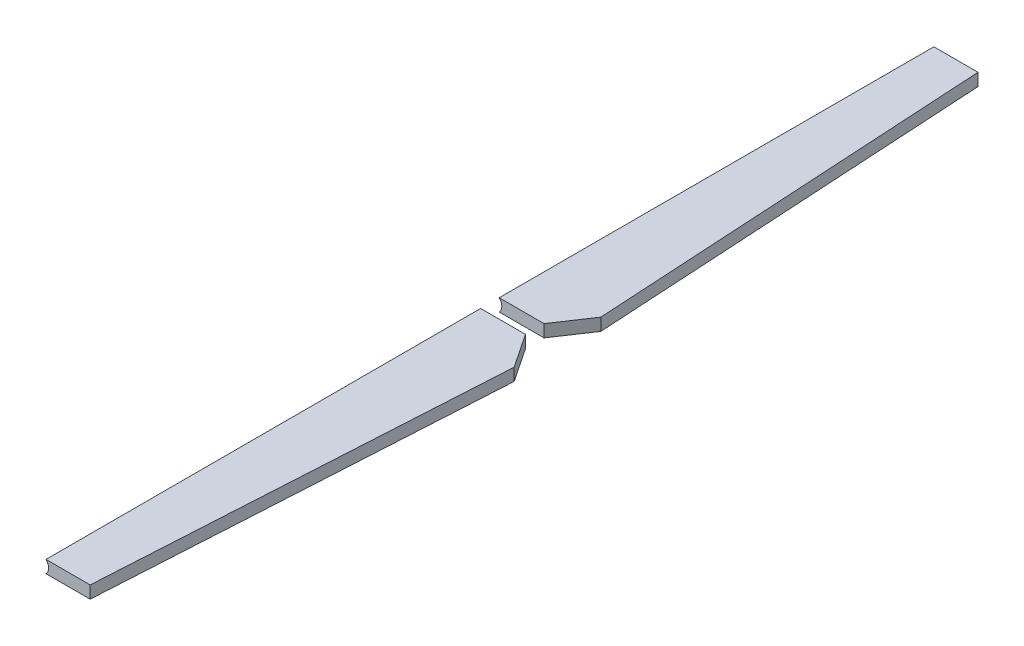
ISO-10303-21;
HEADER;
FILE_DESCRIPTION(('STEP AP214'),'2;1');
FILE_NAME('part.step','',(''),(''),'','','');
FILE_SCHEMA(('AUTOMOTIVE_DESIGN { 1 0 10303 214 1 1 1 1 }'));
ENDSEC;
DATA;
#1=APPLICATION_CONTEXT('core data for automotive mechanical design processes');
#2=APPLICATION_PROTOCOL_DEFINITION('international standard','automotive_design',2000,#1);
#3=PRODUCT_CONTEXT('',#1,'mechanical');
#4=PRODUCT('Part','Part','',(#3));
#5=PRODUCT_RELATED_PRODUCT_CATEGORY('part','',(#4));
#6=PRODUCT_DEFINITION_FORMATION('','',#4);
#7=PRODUCT_DEFINITION_CONTEXT('part definition',#1,'design');
#8=PRODUCT_DEFINITION('design','',#6,#7);
#9=PRODUCT_DEFINITION_SHAPE('','',#8);
#10=(LENGTH_UNIT() NAMED_UNIT(*) SI_UNIT(.MILLI.,.METRE.));
#11=(NAMED_UNIT(*) PLANE_ANGLE_UNIT() SI_UNIT($,.RADIAN.));
#12=(NAMED_UNIT(*) SI_UNIT($,.STERADIAN.) SOLID_ANGLE_UNIT());
#13=UNCERTAINTY_MEASURE_WITH_UNIT(LENGTH_MEASURE(1.E-05),#10,'distance_accuracy_value','');
#14=(GEOMETRIC_REPRESENTATION_CONTEXT(3) GLOBAL_UNCERTAINTY_ASSIGNED_CONTEXT((#13)) GLOBAL_UNIT_ASSIGNED_CONTEXT((#10,
#11,#12)) REPRESENTATION_CONTEXT('',''));
#15=CARTESIAN_POINT('',(0.,0.,0.));
#16=DIRECTION('',(0.,0.,1.));
#17=DIRECTION('',(1.,0.,0.));
#18=AXIS2_PLACEMENT_3D('',#15,#16,#17);
#19=CARTESIAN_POINT('',(30.8367101860676,8.,-146.142614676289));
#20=DIRECTION('',(0.,0.,1.));
#21=DIRECTION('',(-1.,0.,0.));
#22=AXIS2_PLACEMENT_3D('',#19,#20,#21);
#23=PLANE('',#22);
#24=DIRECTION('',(1.,0.,0.));
#25=VECTOR('',#24,1.);
#26=CARTESIAN_POINT('',(30.8367101860676,8.,-146.142614676289));
#27=LINE('',#26,#25);
#28=CARTESIAN_POINT('',(9.44634998023571,8.,-146.142614676289));
#29=VERTEX_POINT('',#28);
#30=CARTESIAN_POINT('',(30.8367101860676,8.,-146.142614676289));
#31=VERTEX_POINT('',#30);
#32=EDGE_CURVE('E104',#29,#31,#27,.T.);
#33=ORIENTED_EDGE('',*,*,#32,.T.);
#34=DIRECTION('',(0.,-1.,0.));
#35=VECTOR('',#34,1.);
#36=CARTESIAN_POINT('',(30.8367101860676,8.,-146.142614676289));
#37=LINE('',#36,#35);
#38=CARTESIAN_POINT('',(30.8367101860676,2.,-146.142614676289));
#39=VERTEX_POINT('',#38);
#40=EDGE_CURVE('E12',#31,#39,#37,.T.);
#41=ORIENTED_EDGE('',*,*,#40,.T.);
#42=DIRECTION('',(1.,0.,0.));
#43=VECTOR('',#42,1.);
#44=CARTESIAN_POINT('',(30.8367101860676,2.,-146.142614676289));
#45=LINE('',#44,#43);
#46=CARTESIAN_POINT('',(9.44634998023571,2.,-146.142614676289));
#47=VERTEX_POINT('',#46);
#48=EDGE_CURVE('E121',#47,#39,#45,.T.);
#49=ORIENTED_EDGE('',*,*,#48,.F.);
#50=CARTESIAN_POINT('',(6.4463499802357,5.,-146.142614676289));
#51=DIRECTION('',(0.,0.,1.));
#52=DIRECTION('',(-1.,0.,0.));
#53=AXIS2_PLACEMENT_3D('',#50,#51,#52);
#54=CIRCLE('',#53,4.24264068711929);
#55=EDGE_CURVE('E109',#47,#29,#54,.T.);
#56=ORIENTED_EDGE('',*,*,#55,.T.);
#57=EDGE_LOOP('',(#33,#41,#49,#56));
#58=FACE_BOUND('',#57,.T.);
#59=ADVANCED_FACE('F49',(#58),#23,.F.);
#60=CARTESIAN_POINT('',(42.1898500211649,8.,47.8686247876649));
#61=DIRECTION('',(-0.998292209621749,0.,0.0584180127060611));
#62=DIRECTION('',(-0.0584180127060611,0.,-0.998292209621749));
#63=AXIS2_PLACEMENT_3D('',#60,#61,#62);
#64=PLANE('',#63);
#65=DIRECTION('',(0.0584180127060611,0.,0.998292209621749));
#66=VECTOR('',#65,1.);
#67=CARTESIAN_POINT('',(42.1898500211649,2.,47.8686247876649));
#68=LINE('',#67,#66);
#69=CARTESIAN_POINT('',(42.1898500211649,2.,47.8686247876649));
#70=VERTEX_POINT('',#69);
#71=EDGE_CURVE('E124',#39,#70,#68,.T.);
#72=ORIENTED_EDGE('',*,*,#71,.F.);
#73=ORIENTED_EDGE('',*,*,#40,.F.);
#74=DIRECTION('',(0.0584180127060611,0.,0.998292209621749));
#75=VECTOR('',#74,1.);
#76=CARTESIAN_POINT('',(42.1898500211649,8.,47.8686247876649));
#77=LINE('',#76,#75);
#78=CARTESIAN_POINT('',(42.1898500211649,8.,47.8686247876649));
#79=VERTEX_POINT('',#78);
#80=EDGE_CURVE('E93',#31,#79,#77,.T.);
#81=ORIENTED_EDGE('',*,*,#80,.T.);
#82=DIRECTION('',(0.,-1.,0.));
#83=VECTOR('',#82,1.);
#84=CARTESIAN_POINT('',(42.1898500211649,8.,47.8686247876649));
#85=LINE('',#84,#83);
#86=EDGE_CURVE('E57',#79,#70,#85,.T.);
#87=ORIENTED_EDGE('',*,*,#86,.T.);
#88=EDGE_LOOP('',(#72,#73,#81,#87));
#89=FACE_BOUND('',#88,.T.);
#90=ADVANCED_FACE('F133',(#89),#64,.F.);
#91=CARTESIAN_POINT('',(42.1898500211649,8.,47.8686247876649));
#92=DIRECTION('',(-0.83156761778236,0.,-0.555423529440167));
#93=DIRECTION('',(0.555423529440167,0.,-0.83156761778236));
#94=AXIS2_PLACEMENT_3D('',#91,#92,#93);
#95=PLANE('',#94);
#96=DIRECTION('',(-0.555423529440167,0.,0.83156761778236));
#97=VECTOR('',#96,1.);
#98=CARTESIAN_POINT('',(42.1898500211649,2.,47.8686247876649));
#99=LINE('',#98,#97);
#100=CARTESIAN_POINT('',(31.1699406207034,2.,64.3673853237115));
#101=VERTEX_POINT('',#100);
#102=EDGE_CURVE('E127',#70,#101,#99,.T.);
#103=ORIENTED_EDGE('',*,*,#102,.F.);
#104=ORIENTED_EDGE('',*,*,#86,.F.);
#105=DIRECTION('',(-0.555423529440167,0.,0.83156761778236));
#106=VECTOR('',#105,1.);
#107=CARTESIAN_POINT('',(42.1898500211649,8.,47.8686247876649));
#108=LINE('',#107,#106);
#109=CARTESIAN_POINT('',(31.1699406207034,8.,64.3673853237115));
#110=VERTEX_POINT('',#109);
#111=EDGE_CURVE('E114',#79,#110,#108,.T.);
#112=ORIENTED_EDGE('',*,*,#111,.T.);
#113=DIRECTION('',(0.,-1.,0.));
#114=VECTOR('',#113,1.);
#115=CARTESIAN_POINT('',(31.1699406207034,8.,64.3673853237115));
#116=LINE('',#115,#114);
#117=EDGE_CURVE('E112',#110,#101,#116,.T.);
#118=ORIENTED_EDGE('',*,*,#117,.T.);
#119=EDGE_LOOP('',(#103,#104,#112,#118));
#120=FACE_BOUND('',#119,.T.);
#121=ADVANCED_FACE('F145',(#120),#95,.F.);
#122=CARTESIAN_POINT('',(9.44634998023578,8.,64.3673853237115));
#123=DIRECTION('',(0.,0.,-1.));
#124=DIRECTION('',(1.,0.,0.));
#125=AXIS2_PLACEMENT_3D('',#122,#123,#124);
#126=PLANE('',#125);
#127=DIRECTION('',(-1.,0.,0.));
#128=VECTOR('',#127,1.);
#129=CARTESIAN_POINT('',(9.44634998023578,2.,64.3673853237115));
#130=LINE('',#129,#128);
#131=CARTESIAN_POINT('',(9.44634998023578,2.,64.3673853237115));
#132=VERTEX_POINT('',#131);
#133=EDGE_CURVE('E82',#101,#132,#130,.T.);
#134=ORIENTED_EDGE('',*,*,#133,.F.);
#135=ORIENTED_EDGE('',*,*,#117,.F.);
#136=DIRECTION('',(-1.,0.,0.));
#137=VECTOR('',#136,1.);
#138=CARTESIAN_POINT('',(21.5545927166665,8.,64.3673853237115));
#139=LINE('',#138,#137);
#140=CARTESIAN_POINT('',(9.44634998023571,8.,64.3673853237115));
#141=VERTEX_POINT('',#140);
#142=EDGE_CURVE('E65',#110,#141,#139,.T.);
#143=ORIENTED_EDGE('',*,*,#142,.T.);
#144=CARTESIAN_POINT('',(6.4463499802357,5.,64.3673853237115));
#145=DIRECTION('',(0.,0.,1.));
#146=DIRECTION('',(-1.,0.,0.));
#147=AXIS2_PLACEMENT_3D('',#144,#145,#146);
#148=CIRCLE('',#147,4.24264068711929);
#149=EDGE_CURVE('E107',#132,#141,#148,.T.);
#150=ORIENTED_EDGE('',*,*,#149,.F.);
#151=EDGE_LOOP('',(#134,#135,#143,#150));
#152=FACE_BOUND('',#151,.T.);
#153=ADVANCED_FACE('F111',(#152),#126,.F.);
#154=CARTESIAN_POINT('',(9.44634998023571,8.,68.8673853237115));
#155=DIRECTION('',(0.,-1.,0.));
#156=DIRECTION('',(0.,0.,1.));
#157=AXIS2_PLACEMENT_3D('',#154,#155,#156);
#158=PLANE('',#157);
#159=DIRECTION('',(0.,0.,-1.));
#160=VECTOR('',#159,1.);
#161=CARTESIAN_POINT('',(9.44634998023571,8.,-146.142614676289));
#162=LINE('',#161,#160);
#163=EDGE_CURVE('E101',#141,#29,#162,.T.);
#164=ORIENTED_EDGE('',*,*,#163,.F.);
#165=ORIENTED_EDGE('',*,*,#142,.F.);
#166=ORIENTED_EDGE('',*,*,#111,.F.);
#167=ORIENTED_EDGE('',*,*,#80,.F.);
#168=ORIENTED_EDGE('',*,*,#32,.F.);
#169=EDGE_LOOP('',(#164,#165,#166,#167,#168));
#170=FACE_BOUND('',#169,.T.);
#171=ADVANCED_FACE('F102',(#170),#158,.F.);
#172=CARTESIAN_POINT('',(9.44634998023571,2.,68.8673853237115));
#173=DIRECTION('',(0.,-1.,0.));
#174=DIRECTION('',(0.,0.,1.));
#175=AXIS2_PLACEMENT_3D('',#172,#173,#174);
#176=PLANE('',#175);
#177=DIRECTION('',(0.,0.,-1.));
#178=VECTOR('',#177,1.);
#179=CARTESIAN_POINT('',(9.44634998023571,2.,-146.142614676289));
#180=LINE('',#179,#178);
#181=EDGE_CURVE('E89',#132,#47,#180,.T.);
#182=ORIENTED_EDGE('',*,*,#181,.T.);
#183=ORIENTED_EDGE('',*,*,#48,.T.);
#184=ORIENTED_EDGE('',*,*,#71,.T.);
#185=ORIENTED_EDGE('',*,*,#102,.T.);
#186=ORIENTED_EDGE('',*,*,#133,.T.);
#187=EDGE_LOOP('',(#182,#183,#184,#185,#186));
#188=FACE_BOUND('',#187,.T.);
#189=ADVANCED_FACE('F136',(#188),#176,.T.);
#190=CARTESIAN_POINT('',(6.4463499802357,5.,64.3673853237115));
#191=DIRECTION('',(0.,0.,-1.));
#192=DIRECTION('',(1.,0.,0.));
#193=AXIS2_PLACEMENT_3D('',#190,#191,#192);
#194=CYLINDRICAL_SURFACE('',#193,4.24264068711929);
#195=ORIENTED_EDGE('',*,*,#55,.F.);
#196=ORIENTED_EDGE('',*,*,#181,.F.);
#197=ORIENTED_EDGE('',*,*,#149,.T.);
#198=ORIENTED_EDGE('',*,*,#163,.T.);
#199=EDGE_LOOP('',(#195,#196,#197,#198));
#200=FACE_BOUND('',#199,.T.);
#201=ADVANCED_FACE('F108',(#200),#194,.F.);
#202=CLOSED_SHELL('',(#59,#90,#121,#153,#171,#189,#201));
#203=MANIFOLD_SOLID_BREP('B2',#202);
#204=CARTESIAN_POINT('',(30.8367101860676,8.,283.877385323711));
#205=DIRECTION('',(0.,0.,-1.));
#206=DIRECTION('',(-1.,0.,0.));
#207=AXIS2_PLACEMENT_3D('',#204,#205,#206);
#208=PLANE('',#207);
#209=DIRECTION('',(1.,0.,0.));
#210=VECTOR('',#209,1.);
#211=CARTESIAN_POINT('',(30.8367101860676,8.,283.877385323711));
#212=LINE('',#211,#210);
#213=CARTESIAN_POINT('',(9.44634998023571,8.,283.877385323711));
#214=VERTEX_POINT('',#213);
#215=CARTESIAN_POINT('',(30.8367101860676,8.,283.877385323711));
#216=VERTEX_POINT('',#215);
#217=EDGE_CURVE('E247',#214,#216,#212,.T.);
#218=ORIENTED_EDGE('',*,*,#217,.F.);
#219=CARTESIAN_POINT('',(6.4463499802357,5.,283.877385323711));
#220=DIRECTION('',(0.,0.,1.));
#221=DIRECTION('',(-1.,0.,0.));
#222=AXIS2_PLACEMENT_3D('',#219,#220,#221);
#223=CIRCLE('',#222,4.24264068711929);
#224=CARTESIAN_POINT('',(9.44634998023571,2.,283.877385323711));
#225=VERTEX_POINT('',#224);
#226=EDGE_CURVE('E258',#225,#214,#223,.T.);
#227=ORIENTED_EDGE('',*,*,#226,.F.);
#228=DIRECTION('',(1.,0.,0.));
#229=VECTOR('',#228,1.);
#230=CARTESIAN_POINT('',(30.8367101860676,2.,283.877385323711));
#231=LINE('',#230,#229);
#232=CARTESIAN_POINT('',(30.8367101860676,2.,283.877385323711));
#233=VERTEX_POINT('',#232);
#234=EDGE_CURVE('E276',#225,#233,#231,.T.);
#235=ORIENTED_EDGE('',*,*,#234,.T.);
#236=DIRECTION('',(0.,-1.,0.));
#237=VECTOR('',#236,1.);
#238=CARTESIAN_POINT('',(30.8367101860676,8.,283.877385323711));
#239=LINE('',#238,#237);
#240=EDGE_CURVE('E47',#216,#233,#239,.T.);
#241=ORIENTED_EDGE('',*,*,#240,.F.);
#242=EDGE_LOOP('',(#218,#227,#235,#241));
#243=FACE_BOUND('',#242,.T.);
#244=ADVANCED_FACE('F202',(#243),#208,.F.);
#245=CARTESIAN_POINT('',(42.1898500211649,8.,89.866145859758));
#246=DIRECTION('',(-0.998292209621749,0.,-0.0584180127060611));
#247=DIRECTION('',(-0.0584180127060611,0.,0.998292209621749));
#248=AXIS2_PLACEMENT_3D('',#245,#246,#247);
#249=PLANE('',#248);
#250=DIRECTION('',(0.0584180127060611,0.,-0.998292209621749));
#251=VECTOR('',#250,1.);
#252=CARTESIAN_POINT('',(42.1898500211649,2.,89.866145859758));
#253=LINE('',#252,#251);
#254=CARTESIAN_POINT('',(42.1898500211649,2.,89.866145859758));
#255=VERTEX_POINT('',#254);
#256=EDGE_CURVE('E278',#233,#255,#253,.T.);
#257=ORIENTED_EDGE('',*,*,#256,.T.);
#258=DIRECTION('',(0.,-1.,0.));
#259=VECTOR('',#258,1.);
#260=CARTESIAN_POINT('',(42.1898500211649,8.,89.866145859758));
#261=LINE('',#260,#259);
#262=CARTESIAN_POINT('',(42.1898500211649,8.,89.866145859758));
#263=VERTEX_POINT('',#262);
#264=EDGE_CURVE('E210',#263,#255,#261,.T.);
#265=ORIENTED_EDGE('',*,*,#264,.F.);
#266=DIRECTION('',(0.0584180127060611,0.,-0.998292209621749));
#267=VECTOR('',#266,1.);
#268=CARTESIAN_POINT('',(42.1898500211649,8.,89.866145859758));
#269=LINE('',#268,#267);
#270=EDGE_CURVE('E271',#216,#263,#269,.T.);
#271=ORIENTED_EDGE('',*,*,#270,.F.);
#272=ORIENTED_EDGE('',*,*,#240,.T.);
#273=EDGE_LOOP('',(#257,#265,#271,#272));
#274=FACE_BOUND('',#273,.T.);
#275=ADVANCED_FACE('F291',(#274),#249,.F.);
#276=CARTESIAN_POINT('',(42.1898500211649,8.,89.866145859758));
#277=DIRECTION('',(-0.83156761778236,0.,0.555423529440167));
#278=DIRECTION('',(0.555423529440167,0.,0.83156761778236));
#279=AXIS2_PLACEMENT_3D('',#276,#277,#278);
#280=PLANE('',#279);
#281=DIRECTION('',(-0.555423529440167,0.,-0.83156761778236));
#282=VECTOR('',#281,1.);
#283=CARTESIAN_POINT('',(42.1898500211649,2.,89.866145859758));
#284=LINE('',#283,#282);
#285=CARTESIAN_POINT('',(31.1699406207034,2.,73.3673853237115));
#286=VERTEX_POINT('',#285);
#287=EDGE_CURVE('E280',#255,#286,#284,.T.);
#288=ORIENTED_EDGE('',*,*,#287,.T.);
#289=DIRECTION('',(0.,-1.,0.));
#290=VECTOR('',#289,1.);
#291=CARTESIAN_POINT('',(31.1699406207034,8.,73.3673853237115));
#292=LINE('',#291,#290);
#293=CARTESIAN_POINT('',(31.1699406207034,8.,73.3673853237115));
#294=VERTEX_POINT('',#293);
#295=EDGE_CURVE('E268',#294,#286,#292,.T.);
#296=ORIENTED_EDGE('',*,*,#295,.F.);
#297=DIRECTION('',(-0.555423529440167,0.,-0.83156761778236));
#298=VECTOR('',#297,1.);
#299=CARTESIAN_POINT('',(42.1898500211649,8.,89.866145859758));
#300=LINE('',#299,#298);
#301=EDGE_CURVE('E218',#263,#294,#300,.T.);
#302=ORIENTED_EDGE('',*,*,#301,.F.);
#303=ORIENTED_EDGE('',*,*,#264,.T.);
#304=EDGE_LOOP('',(#288,#296,#302,#303));
#305=FACE_BOUND('',#304,.T.);
#306=ADVANCED_FACE('F285',(#305),#280,.F.);
#307=CARTESIAN_POINT('',(9.44634998023578,8.,73.3673853237115));
#308=DIRECTION('',(0.,0.,1.));
#309=DIRECTION('',(1.,0.,0.));
#310=AXIS2_PLACEMENT_3D('',#307,#308,#309);
#311=PLANE('',#310);
#312=DIRECTION('',(-1.,0.,0.));
#313=VECTOR('',#312,1.);
#314=CARTESIAN_POINT('',(9.44634998023578,2.,73.3673853237115));
#315=LINE('',#314,#313);
#316=CARTESIAN_POINT('',(9.44634998023578,2.,73.3673853237115));
#317=VERTEX_POINT('',#316);
#318=EDGE_CURVE('E236',#286,#317,#315,.T.);
#319=ORIENTED_EDGE('',*,*,#318,.T.);
#320=CARTESIAN_POINT('',(6.4463499802357,5.,73.3673853237115));
#321=DIRECTION('',(0.,0.,1.));
#322=DIRECTION('',(-1.,0.,0.));
#323=AXIS2_PLACEMENT_3D('',#320,#321,#322);
#324=CIRCLE('',#323,4.24264068711929);
#325=CARTESIAN_POINT('',(9.44634998023571,8.,73.3673853237115));
#326=VERTEX_POINT('',#325);
#327=EDGE_CURVE('E243',#317,#326,#324,.T.);
#328=ORIENTED_EDGE('',*,*,#327,.T.);
#329=DIRECTION('',(-1.,0.,0.));
#330=VECTOR('',#329,1.);
#331=CARTESIAN_POINT('',(21.5545927166665,8.,73.3673853237115));
#332=LINE('',#331,#330);
#333=EDGE_CURVE('E264',#294,#326,#332,.T.);
#334=ORIENTED_EDGE('',*,*,#333,.F.);
#335=ORIENTED_EDGE('',*,*,#295,.T.);
#336=EDGE_LOOP('',(#319,#328,#334,#335));
#337=FACE_BOUND('',#336,.T.);
#338=ADVANCED_FACE('F262',(#337),#311,.F.);
#339=CARTESIAN_POINT('',(9.44634998023571,8.,68.8673853237115));
#340=DIRECTION('',(0.,-1.,0.));
#341=DIRECTION('',(0.,0.,-1.));
#342=AXIS2_PLACEMENT_3D('',#339,#340,#341);
#343=PLANE('',#342);
#344=DIRECTION('',(0.,0.,1.));
#345=VECTOR('',#344,1.);
#346=CARTESIAN_POINT('',(9.44634998023571,8.,283.877385323711));
#347=LINE('',#346,#345);
#348=EDGE_CURVE('E255',#326,#214,#347,.T.);
#349=ORIENTED_EDGE('',*,*,#348,.T.);
#350=ORIENTED_EDGE('',*,*,#217,.T.);
#351=ORIENTED_EDGE('',*,*,#270,.T.);
#352=ORIENTED_EDGE('',*,*,#301,.T.);
#353=ORIENTED_EDGE('',*,*,#333,.T.);
#354=EDGE_LOOP('',(#349,#350,#351,#352,#353));
#355=FACE_BOUND('',#354,.T.);
#356=ADVANCED_FACE('F267',(#355),#343,.F.);
#357=CARTESIAN_POINT('',(9.44634998023571,2.,68.8673853237115));
#358=DIRECTION('',(0.,-1.,0.));
#359=DIRECTION('',(0.,0.,-1.));
#360=AXIS2_PLACEMENT_3D('',#357,#358,#359);
#361=PLANE('',#360);
#362=DIRECTION('',(0.,0.,1.));
#363=VECTOR('',#362,1.);
#364=CARTESIAN_POINT('',(9.44634998023571,2.,283.877385323711));
#365=LINE('',#364,#363);
#366=EDGE_CURVE('E265',#317,#225,#365,.T.);
#367=ORIENTED_EDGE('',*,*,#366,.F.);
#368=ORIENTED_EDGE('',*,*,#318,.F.);
#369=ORIENTED_EDGE('',*,*,#287,.F.);
#370=ORIENTED_EDGE('',*,*,#256,.F.);
#371=ORIENTED_EDGE('',*,*,#234,.F.);
#372=EDGE_LOOP('',(#367,#368,#369,#370,#371));
#373=FACE_BOUND('',#372,.T.);
#374=ADVANCED_FACE('F289',(#373),#361,.T.);
#375=CARTESIAN_POINT('',(6.4463499802357,5.,73.3673853237115));
#376=DIRECTION('',(0.,0.,1.));
#377=DIRECTION('',(1.,0.,0.));
#378=AXIS2_PLACEMENT_3D('',#375,#376,#377);
#379=CYLINDRICAL_SURFACE('',#378,4.24264068711929);
#380=ORIENTED_EDGE('',*,*,#226,.T.);
#381=ORIENTED_EDGE('',*,*,#348,.F.);
#382=ORIENTED_EDGE('',*,*,#327,.F.);
#383=ORIENTED_EDGE('',*,*,#366,.T.);
#384=EDGE_LOOP('',(#380,#381,#382,#383));
#385=FACE_BOUND('',#384,.T.);
#386=ADVANCED_FACE('F256',(#385),#379,.F.);
#387=CLOSED_SHELL('',(#244,#275,#306,#338,#356,#374,#386));
#388=MANIFOLD_SOLID_BREP('B6',#387);
#389=ADVANCED_BREP_SHAPE_REPRESENTATION('',(#18,#203,#388),#14);
#390=SHAPE_DEFINITION_REPRESENTATION(#9,#389);
ENDSEC;
END-ISO-10303-21;
